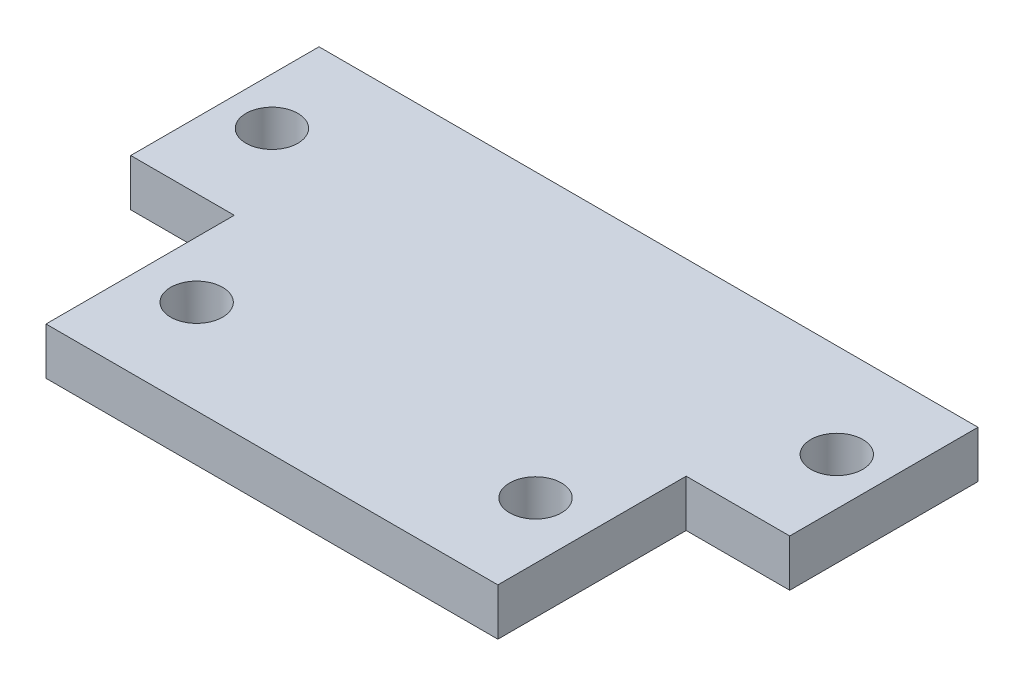
ISO-10303-21;
HEADER;
FILE_DESCRIPTION(('STEP AP214'),'2;1');
FILE_NAME('part.step','',(''),(''),'','','');
FILE_SCHEMA(('AUTOMOTIVE_DESIGN { 1 0 10303 214 1 1 1 1 }'));
ENDSEC;
DATA;
#1=APPLICATION_CONTEXT('core data for automotive mechanical design processes');
#2=APPLICATION_PROTOCOL_DEFINITION('international standard','automotive_design',2000,#1);
#3=PRODUCT_CONTEXT('',#1,'mechanical');
#4=PRODUCT('Part','Part','',(#3));
#5=PRODUCT_RELATED_PRODUCT_CATEGORY('part','',(#4));
#6=PRODUCT_DEFINITION_FORMATION('','',#4);
#7=PRODUCT_DEFINITION_CONTEXT('part definition',#1,'design');
#8=PRODUCT_DEFINITION('design','',#6,#7);
#9=PRODUCT_DEFINITION_SHAPE('','',#8);
#10=(LENGTH_UNIT() NAMED_UNIT(*) SI_UNIT(.MILLI.,.METRE.));
#11=(NAMED_UNIT(*) PLANE_ANGLE_UNIT() SI_UNIT($,.RADIAN.));
#12=(NAMED_UNIT(*) SI_UNIT($,.STERADIAN.) SOLID_ANGLE_UNIT());
#13=UNCERTAINTY_MEASURE_WITH_UNIT(LENGTH_MEASURE(1.E-05),#10,'distance_accuracy_value','');
#14=(GEOMETRIC_REPRESENTATION_CONTEXT(3) GLOBAL_UNCERTAINTY_ASSIGNED_CONTEXT((#13)) GLOBAL_UNIT_ASSIGNED_CONTEXT((#10,
#11,#12)) REPRESENTATION_CONTEXT('',''));
#15=CARTESIAN_POINT('',(0.,0.,0.));
#16=DIRECTION('',(0.,0.,1.));
#17=DIRECTION('',(1.,0.,0.));
#18=AXIS2_PLACEMENT_3D('',#15,#16,#17);
#19=CARTESIAN_POINT('',(15.24,3.175,0.));
#20=DIRECTION('',(1.,0.,0.));
#21=DIRECTION('',(0.,0.,-1.));
#22=AXIS2_PLACEMENT_3D('',#19,#20,#21);
#23=PLANE('',#22);
#24=DIRECTION('',(0.,0.,1.));
#25=VECTOR('',#24,1.);
#26=CARTESIAN_POINT('',(15.24,0.,0.));
#27=LINE('',#26,#25);
#28=CARTESIAN_POINT('',(15.24,0.,6.35));
#29=VERTEX_POINT('',#28);
#30=CARTESIAN_POINT('',(15.24,0.,19.05));
#31=VERTEX_POINT('',#30);
#32=EDGE_CURVE('E150',#29,#31,#27,.T.);
#33=ORIENTED_EDGE('',*,*,#32,.F.);
#34=DIRECTION('',(0.,-1.,0.));
#35=VECTOR('',#34,1.);
#36=CARTESIAN_POINT('',(15.24,3.175,6.35));
#37=LINE('',#36,#35);
#38=CARTESIAN_POINT('',(15.24,3.175,6.35));
#39=VERTEX_POINT('',#38);
#40=EDGE_CURVE('E11',#39,#29,#37,.T.);
#41=ORIENTED_EDGE('',*,*,#40,.F.);
#42=DIRECTION('',(0.,0.,1.));
#43=VECTOR('',#42,1.);
#44=CARTESIAN_POINT('',(15.24,3.175,0.));
#45=LINE('',#44,#43);
#46=CARTESIAN_POINT('',(15.24,3.175,19.05));
#47=VERTEX_POINT('',#46);
#48=EDGE_CURVE('E174',#39,#47,#45,.T.);
#49=ORIENTED_EDGE('',*,*,#48,.T.);
#50=DIRECTION('',(0.,-1.,0.));
#51=VECTOR('',#50,1.);
#52=CARTESIAN_POINT('',(15.24,3.175,19.05));
#53=LINE('',#52,#51);
#54=EDGE_CURVE('E62',#47,#31,#53,.T.);
#55=ORIENTED_EDGE('',*,*,#54,.T.);
#56=EDGE_LOOP('',(#33,#41,#49,#55));
#57=FACE_BOUND('',#56,.T.);
#58=ADVANCED_FACE('F44',(#57),#23,.T.);
#59=CARTESIAN_POINT('',(0.,3.175,6.35));
#60=DIRECTION('',(0.,0.,-1.));
#61=DIRECTION('',(-1.,0.,0.));
#62=AXIS2_PLACEMENT_3D('',#59,#60,#61);
#63=PLANE('',#62);
#64=DIRECTION('',(1.,0.,0.));
#65=VECTOR('',#64,1.);
#66=CARTESIAN_POINT('',(0.,0.,6.35));
#67=LINE('',#66,#65);
#68=CARTESIAN_POINT('',(22.225,0.,6.35));
#69=VERTEX_POINT('',#68);
#70=EDGE_CURVE('E152',#29,#69,#67,.T.);
#71=ORIENTED_EDGE('',*,*,#70,.T.);
#72=DIRECTION('',(0.,-1.,0.));
#73=VECTOR('',#72,1.);
#74=CARTESIAN_POINT('',(22.225,3.175,6.35));
#75=LINE('',#74,#73);
#76=CARTESIAN_POINT('',(22.225,3.175,6.35));
#77=VERTEX_POINT('',#76);
#78=EDGE_CURVE('E53',#77,#69,#75,.T.);
#79=ORIENTED_EDGE('',*,*,#78,.F.);
#80=DIRECTION('',(1.,0.,0.));
#81=VECTOR('',#80,1.);
#82=CARTESIAN_POINT('',(0.,3.175,6.35));
#83=LINE('',#82,#81);
#84=EDGE_CURVE('E127',#39,#77,#83,.T.);
#85=ORIENTED_EDGE('',*,*,#84,.F.);
#86=ORIENTED_EDGE('',*,*,#40,.T.);
#87=EDGE_LOOP('',(#71,#79,#85,#86));
#88=FACE_BOUND('',#87,.T.);
#89=ADVANCED_FACE('F223',(#88),#63,.F.);
#90=CARTESIAN_POINT('',(22.225,3.175,0.));
#91=DIRECTION('',(1.,0.,0.));
#92=DIRECTION('',(0.,0.,-1.));
#93=AXIS2_PLACEMENT_3D('',#90,#91,#92);
#94=PLANE('',#93);
#95=DIRECTION('',(0.,0.,1.));
#96=VECTOR('',#95,1.);
#97=CARTESIAN_POINT('',(22.225,0.,0.));
#98=LINE('',#97,#96);
#99=CARTESIAN_POINT('',(22.225,0.,-6.35));
#100=VERTEX_POINT('',#99);
#101=EDGE_CURVE('E155',#100,#69,#98,.T.);
#102=ORIENTED_EDGE('',*,*,#101,.F.);
#103=DIRECTION('',(0.,-1.,0.));
#104=VECTOR('',#103,1.);
#105=CARTESIAN_POINT('',(22.225,3.175,-6.35));
#106=LINE('',#105,#104);
#107=CARTESIAN_POINT('',(22.225,3.175,-6.35));
#108=VERTEX_POINT('',#107);
#109=EDGE_CURVE('E180',#108,#100,#106,.T.);
#110=ORIENTED_EDGE('',*,*,#109,.F.);
#111=DIRECTION('',(0.,0.,1.));
#112=VECTOR('',#111,1.);
#113=CARTESIAN_POINT('',(22.225,3.175,0.));
#114=LINE('',#113,#112);
#115=EDGE_CURVE('E197',#108,#77,#114,.T.);
#116=ORIENTED_EDGE('',*,*,#115,.T.);
#117=ORIENTED_EDGE('',*,*,#78,.T.);
#118=EDGE_LOOP('',(#102,#110,#116,#117));
#119=FACE_BOUND('',#118,.T.);
#120=ADVANCED_FACE('F208',(#119),#94,.T.);
#121=CARTESIAN_POINT('',(0.,3.175,-6.35));
#122=DIRECTION('',(0.,0.,-1.));
#123=DIRECTION('',(-1.,0.,0.));
#124=AXIS2_PLACEMENT_3D('',#121,#122,#123);
#125=PLANE('',#124);
#126=DIRECTION('',(1.,0.,0.));
#127=VECTOR('',#126,1.);
#128=CARTESIAN_POINT('',(0.,0.,-6.35));
#129=LINE('',#128,#127);
#130=CARTESIAN_POINT('',(-22.225,0.,-6.35));
#131=VERTEX_POINT('',#130);
#132=EDGE_CURVE('E158',#131,#100,#129,.T.);
#133=ORIENTED_EDGE('',*,*,#132,.F.);
#134=DIRECTION('',(0.,-1.,0.));
#135=VECTOR('',#134,1.);
#136=CARTESIAN_POINT('',(-22.225,3.175,-6.35));
#137=LINE('',#136,#135);
#138=CARTESIAN_POINT('',(-22.225,3.175,-6.35));
#139=VERTEX_POINT('',#138);
#140=EDGE_CURVE('E178',#139,#131,#137,.T.);
#141=ORIENTED_EDGE('',*,*,#140,.F.);
#142=DIRECTION('',(1.,0.,0.));
#143=VECTOR('',#142,1.);
#144=CARTESIAN_POINT('',(0.,3.175,-6.35));
#145=LINE('',#144,#143);
#146=EDGE_CURVE('E199',#139,#108,#145,.T.);
#147=ORIENTED_EDGE('',*,*,#146,.T.);
#148=ORIENTED_EDGE('',*,*,#109,.T.);
#149=EDGE_LOOP('',(#133,#141,#147,#148));
#150=FACE_BOUND('',#149,.T.);
#151=ADVANCED_FACE('F203',(#150),#125,.T.);
#152=CARTESIAN_POINT('',(-22.225,3.175,0.));
#153=DIRECTION('',(1.,0.,0.));
#154=DIRECTION('',(0.,0.,-1.));
#155=AXIS2_PLACEMENT_3D('',#152,#153,#154);
#156=PLANE('',#155);
#157=DIRECTION('',(0.,0.,1.));
#158=VECTOR('',#157,1.);
#159=CARTESIAN_POINT('',(-22.225,0.,0.));
#160=LINE('',#159,#158);
#161=CARTESIAN_POINT('',(-22.225,0.,6.35));
#162=VERTEX_POINT('',#161);
#163=EDGE_CURVE('E161',#131,#162,#160,.T.);
#164=ORIENTED_EDGE('',*,*,#163,.T.);
#165=DIRECTION('',(0.,-1.,0.));
#166=VECTOR('',#165,1.);
#167=CARTESIAN_POINT('',(-22.225,3.175,6.35));
#168=LINE('',#167,#166);
#169=CARTESIAN_POINT('',(-22.225,3.175,6.35));
#170=VERTEX_POINT('',#169);
#171=EDGE_CURVE('E135',#170,#162,#168,.T.);
#172=ORIENTED_EDGE('',*,*,#171,.F.);
#173=DIRECTION('',(0.,0.,1.));
#174=VECTOR('',#173,1.);
#175=CARTESIAN_POINT('',(-22.225,3.175,0.));
#176=LINE('',#175,#174);
#177=EDGE_CURVE('E122',#139,#170,#176,.T.);
#178=ORIENTED_EDGE('',*,*,#177,.F.);
#179=ORIENTED_EDGE('',*,*,#140,.T.);
#180=EDGE_LOOP('',(#164,#172,#178,#179));
#181=FACE_BOUND('',#180,.T.);
#182=ADVANCED_FACE('F215',(#181),#156,.F.);
#183=CARTESIAN_POINT('',(-15.24,0.,6.35));
#184=VERTEX_POINT('',#183);
#185=EDGE_CURVE('E132',#162,#184,#67,.T.);
#186=ORIENTED_EDGE('',*,*,#185,.T.);
#187=DIRECTION('',(0.,-1.,0.));
#188=VECTOR('',#187,1.);
#189=CARTESIAN_POINT('',(-15.24,3.175,6.35));
#190=LINE('',#189,#188);
#191=CARTESIAN_POINT('',(-15.24,3.175,6.35));
#192=VERTEX_POINT('',#191);
#193=EDGE_CURVE('E129',#192,#184,#190,.T.);
#194=ORIENTED_EDGE('',*,*,#193,.F.);
#195=EDGE_CURVE('E112',#170,#192,#83,.T.);
#196=ORIENTED_EDGE('',*,*,#195,.F.);
#197=ORIENTED_EDGE('',*,*,#171,.T.);
#198=EDGE_LOOP('',(#186,#194,#196,#197));
#199=FACE_BOUND('',#198,.T.);
#200=ADVANCED_FACE('F130',(#199),#63,.F.);
#201=CARTESIAN_POINT('',(-15.24,3.175,0.));
#202=DIRECTION('',(1.,0.,0.));
#203=DIRECTION('',(0.,0.,-1.));
#204=AXIS2_PLACEMENT_3D('',#201,#202,#203);
#205=PLANE('',#204);
#206=DIRECTION('',(0.,0.,1.));
#207=VECTOR('',#206,1.);
#208=CARTESIAN_POINT('',(-15.24,0.,0.));
#209=LINE('',#208,#207);
#210=CARTESIAN_POINT('',(-15.24,0.,19.05));
#211=VERTEX_POINT('',#210);
#212=EDGE_CURVE('E163',#184,#211,#209,.T.);
#213=ORIENTED_EDGE('',*,*,#212,.T.);
#214=DIRECTION('',(0.,-1.,0.));
#215=VECTOR('',#214,1.);
#216=CARTESIAN_POINT('',(-15.24,3.175,19.05));
#217=LINE('',#216,#215);
#218=CARTESIAN_POINT('',(-15.24,3.175,19.05));
#219=VERTEX_POINT('',#218);
#220=EDGE_CURVE('E88',#219,#211,#217,.T.);
#221=ORIENTED_EDGE('',*,*,#220,.F.);
#222=DIRECTION('',(0.,0.,1.));
#223=VECTOR('',#222,1.);
#224=CARTESIAN_POINT('',(-15.24,3.175,0.));
#225=LINE('',#224,#223);
#226=EDGE_CURVE('E119',#192,#219,#225,.T.);
#227=ORIENTED_EDGE('',*,*,#226,.F.);
#228=ORIENTED_EDGE('',*,*,#193,.T.);
#229=EDGE_LOOP('',(#213,#221,#227,#228));
#230=FACE_BOUND('',#229,.T.);
#231=ADVANCED_FACE('F137',(#230),#205,.F.);
#232=CARTESIAN_POINT('',(19.05,3.175,0.));
#233=DIRECTION('',(0.,-1.,0.));
#234=DIRECTION('',(0.,0.,-1.));
#235=AXIS2_PLACEMENT_3D('',#232,#233,#234);
#236=CYLINDRICAL_SURFACE('',#235,1.75);
#237=CARTESIAN_POINT('',(19.05,3.175,0.));
#238=DIRECTION('',(0.,1.,0.));
#239=DIRECTION('',(0.,0.,1.));
#240=AXIS2_PLACEMENT_3D('',#237,#238,#239);
#241=CIRCLE('',#240,1.75);
#242=CARTESIAN_POINT('',(19.05,3.175,1.75));
#243=VERTEX_POINT('',#242);
#244=EDGE_CURVE('E140',#243,#243,#241,.T.);
#245=ORIENTED_EDGE('',*,*,#244,.T.);
#246=EDGE_LOOP('',(#245));
#247=FACE_BOUND('',#246,.T.);
#248=CARTESIAN_POINT('',(19.05,0.,0.));
#249=DIRECTION('',(0.,1.,0.));
#250=DIRECTION('',(0.,0.,1.));
#251=AXIS2_PLACEMENT_3D('',#248,#249,#250);
#252=CIRCLE('',#251,1.75);
#253=CARTESIAN_POINT('',(19.05,0.,1.75));
#254=VERTEX_POINT('',#253);
#255=EDGE_CURVE('E168',#254,#254,#252,.T.);
#256=ORIENTED_EDGE('',*,*,#255,.F.);
#257=EDGE_LOOP('',(#256));
#258=FACE_BOUND('',#257,.T.);
#259=ADVANCED_FACE('F233',(#247,#258),#236,.F.);
#260=CARTESIAN_POINT('',(0.,3.175,19.05));
#261=DIRECTION('',(0.,0.,1.));
#262=DIRECTION('',(1.,0.,0.));
#263=AXIS2_PLACEMENT_3D('',#260,#261,#262);
#264=PLANE('',#263);
#265=DIRECTION('',(-1.,0.,0.));
#266=VECTOR('',#265,1.);
#267=CARTESIAN_POINT('',(0.,0.,19.05));
#268=LINE('',#267,#266);
#269=EDGE_CURVE('E165',#31,#211,#268,.T.);
#270=ORIENTED_EDGE('',*,*,#269,.F.);
#271=ORIENTED_EDGE('',*,*,#54,.F.);
#272=DIRECTION('',(-1.,0.,0.));
#273=VECTOR('',#272,1.);
#274=CARTESIAN_POINT('',(0.,3.175,19.05));
#275=LINE('',#274,#273);
#276=EDGE_CURVE('E138',#47,#219,#275,.T.);
#277=ORIENTED_EDGE('',*,*,#276,.T.);
#278=ORIENTED_EDGE('',*,*,#220,.T.);
#279=EDGE_LOOP('',(#270,#271,#277,#278));
#280=FACE_BOUND('',#279,.T.);
#281=ADVANCED_FACE('F230',(#280),#264,.T.);
#282=CARTESIAN_POINT('',(-19.05,3.175,0.));
#283=DIRECTION('',(0.,-1.,0.));
#284=DIRECTION('',(0.,0.,-1.));
#285=AXIS2_PLACEMENT_3D('',#282,#283,#284);
#286=CYLINDRICAL_SURFACE('',#285,1.75);
#287=CARTESIAN_POINT('',(-19.05,3.175,0.));
#288=DIRECTION('',(0.,1.,0.));
#289=DIRECTION('',(0.,0.,1.));
#290=AXIS2_PLACEMENT_3D('',#287,#288,#289);
#291=CIRCLE('',#290,1.75);
#292=CARTESIAN_POINT('',(-19.05,3.175,1.75));
#293=VERTEX_POINT('',#292);
#294=EDGE_CURVE('E147',#293,#293,#291,.T.);
#295=ORIENTED_EDGE('',*,*,#294,.T.);
#296=EDGE_LOOP('',(#295));
#297=FACE_BOUND('',#296,.T.);
#298=CARTESIAN_POINT('',(-19.05,0.,0.));
#299=DIRECTION('',(0.,1.,0.));
#300=DIRECTION('',(0.,0.,1.));
#301=AXIS2_PLACEMENT_3D('',#298,#299,#300);
#302=CIRCLE('',#301,1.75);
#303=CARTESIAN_POINT('',(-19.05,0.,1.75));
#304=VERTEX_POINT('',#303);
#305=EDGE_CURVE('E171',#304,#304,#302,.T.);
#306=ORIENTED_EDGE('',*,*,#305,.F.);
#307=EDGE_LOOP('',(#306));
#308=FACE_BOUND('',#307,.T.);
#309=ADVANCED_FACE('F232',(#297,#308),#286,.F.);
#310=CARTESIAN_POINT('',(0.,3.175,0.));
#311=DIRECTION('',(0.,1.,0.));
#312=DIRECTION('',(0.,0.,1.));
#313=AXIS2_PLACEMENT_3D('',#310,#311,#312);
#314=PLANE('',#313);
#315=CARTESIAN_POINT('',(11.43,3.175,12.7));
#316=DIRECTION('',(0.,1.,0.));
#317=DIRECTION('',(0.,0.,1.));
#318=AXIS2_PLACEMENT_3D('',#315,#316,#317);
#319=CIRCLE('',#318,1.75);
#320=CARTESIAN_POINT('',(11.43,3.175,14.45));
#321=VERTEX_POINT('',#320);
#322=EDGE_CURVE('E184',#321,#321,#319,.T.);
#323=ORIENTED_EDGE('',*,*,#322,.F.);
#324=EDGE_LOOP('',(#323));
#325=FACE_BOUND('',#324,.T.);
#326=CARTESIAN_POINT('',(-11.43,3.175,12.7));
#327=DIRECTION('',(0.,1.,0.));
#328=DIRECTION('',(0.,0.,-1.));
#329=AXIS2_PLACEMENT_3D('',#326,#327,#328);
#330=CIRCLE('',#329,1.75);
#331=CARTESIAN_POINT('',(-11.43,3.175,10.95));
#332=VERTEX_POINT('',#331);
#333=EDGE_CURVE('E189',#332,#332,#330,.T.);
#334=ORIENTED_EDGE('',*,*,#333,.F.);
#335=EDGE_LOOP('',(#334));
#336=FACE_BOUND('',#335,.T.);
#337=ORIENTED_EDGE('',*,*,#48,.F.);
#338=ORIENTED_EDGE('',*,*,#84,.T.);
#339=ORIENTED_EDGE('',*,*,#115,.F.);
#340=ORIENTED_EDGE('',*,*,#146,.F.);
#341=ORIENTED_EDGE('',*,*,#177,.T.);
#342=ORIENTED_EDGE('',*,*,#195,.T.);
#343=ORIENTED_EDGE('',*,*,#226,.T.);
#344=ORIENTED_EDGE('',*,*,#276,.F.);
#345=EDGE_LOOP('',(#337,#338,#339,#340,#341,#342,#343,#344));
#346=FACE_BOUND('',#345,.T.);
#347=ORIENTED_EDGE('',*,*,#244,.F.);
#348=EDGE_LOOP('',(#347));
#349=FACE_BOUND('',#348,.T.);
#350=ORIENTED_EDGE('',*,*,#294,.F.);
#351=EDGE_LOOP('',(#350));
#352=FACE_BOUND('',#351,.T.);
#353=ADVANCED_FACE('F115',(#325,#336,#346,#349,#352),#314,.T.);
#354=CARTESIAN_POINT('',(0.,0.,0.));
#355=DIRECTION('',(0.,1.,0.));
#356=DIRECTION('',(0.,0.,1.));
#357=AXIS2_PLACEMENT_3D('',#354,#355,#356);
#358=PLANE('',#357);
#359=CARTESIAN_POINT('',(11.43,0.,12.7));
#360=DIRECTION('',(0.,1.,0.));
#361=DIRECTION('',(0.,0.,1.));
#362=AXIS2_PLACEMENT_3D('',#359,#360,#361);
#363=CIRCLE('',#362,1.75);
#364=CARTESIAN_POINT('',(11.43,0.,14.45));
#365=VERTEX_POINT('',#364);
#366=EDGE_CURVE('E47',#365,#365,#363,.T.);
#367=ORIENTED_EDGE('',*,*,#366,.T.);
#368=EDGE_LOOP('',(#367));
#369=FACE_BOUND('',#368,.T.);
#370=CARTESIAN_POINT('',(-11.43,0.,12.7));
#371=DIRECTION('',(0.,1.,0.));
#372=DIRECTION('',(0.,0.,1.));
#373=AXIS2_PLACEMENT_3D('',#370,#371,#372);
#374=CIRCLE('',#373,1.75);
#375=CARTESIAN_POINT('',(-11.43,0.,14.45));
#376=VERTEX_POINT('',#375);
#377=EDGE_CURVE('E182',#376,#376,#374,.T.);
#378=ORIENTED_EDGE('',*,*,#377,.T.);
#379=EDGE_LOOP('',(#378));
#380=FACE_BOUND('',#379,.T.);
#381=ORIENTED_EDGE('',*,*,#32,.T.);
#382=ORIENTED_EDGE('',*,*,#269,.T.);
#383=ORIENTED_EDGE('',*,*,#212,.F.);
#384=ORIENTED_EDGE('',*,*,#185,.F.);
#385=ORIENTED_EDGE('',*,*,#163,.F.);
#386=ORIENTED_EDGE('',*,*,#132,.T.);
#387=ORIENTED_EDGE('',*,*,#101,.T.);
#388=ORIENTED_EDGE('',*,*,#70,.F.);
#389=EDGE_LOOP('',(#381,#382,#383,#384,#385,#386,#387,#388));
#390=FACE_BOUND('',#389,.T.);
#391=ORIENTED_EDGE('',*,*,#255,.T.);
#392=EDGE_LOOP('',(#391));
#393=FACE_BOUND('',#392,.T.);
#394=ORIENTED_EDGE('',*,*,#305,.T.);
#395=EDGE_LOOP('',(#394));
#396=FACE_BOUND('',#395,.T.);
#397=ADVANCED_FACE('F212',(#369,#380,#390,#393,#396),#358,.F.);
#398=CARTESIAN_POINT('',(-11.43,-9.017,12.7));
#399=DIRECTION('',(0.,1.,0.));
#400=DIRECTION('',(0.,0.,1.));
#401=AXIS2_PLACEMENT_3D('',#398,#399,#400);
#402=CYLINDRICAL_SURFACE('',#401,1.75);
#403=ORIENTED_EDGE('',*,*,#333,.T.);
#404=EDGE_LOOP('',(#403));
#405=FACE_BOUND('',#404,.T.);
#406=ORIENTED_EDGE('',*,*,#377,.F.);
#407=EDGE_LOOP('',(#406));
#408=FACE_BOUND('',#407,.T.);
#409=ADVANCED_FACE('F289',(#405,#408),#402,.F.);
#410=CARTESIAN_POINT('',(11.43,-9.017,12.7));
#411=DIRECTION('',(0.,1.,0.));
#412=DIRECTION('',(0.,0.,1.));
#413=AXIS2_PLACEMENT_3D('',#410,#411,#412);
#414=CYLINDRICAL_SURFACE('',#413,1.75);
#415=ORIENTED_EDGE('',*,*,#322,.T.);
#416=EDGE_LOOP('',(#415));
#417=FACE_BOUND('',#416,.T.);
#418=ORIENTED_EDGE('',*,*,#366,.F.);
#419=EDGE_LOOP('',(#418));
#420=FACE_BOUND('',#419,.T.);
#421=ADVANCED_FACE('F305',(#417,#420),#414,.F.);
#422=CLOSED_SHELL('',(#58,#89,#120,#151,#182,#200,#231,#259,#281,#309,#353,#397,#409,#421));
#423=MANIFOLD_SOLID_BREP('B2',#422);
#424=ADVANCED_BREP_SHAPE_REPRESENTATION('',(#18,#423),#14);
#425=SHAPE_DEFINITION_REPRESENTATION(#9,#424);
ENDSEC;
END-ISO-10303-21;
